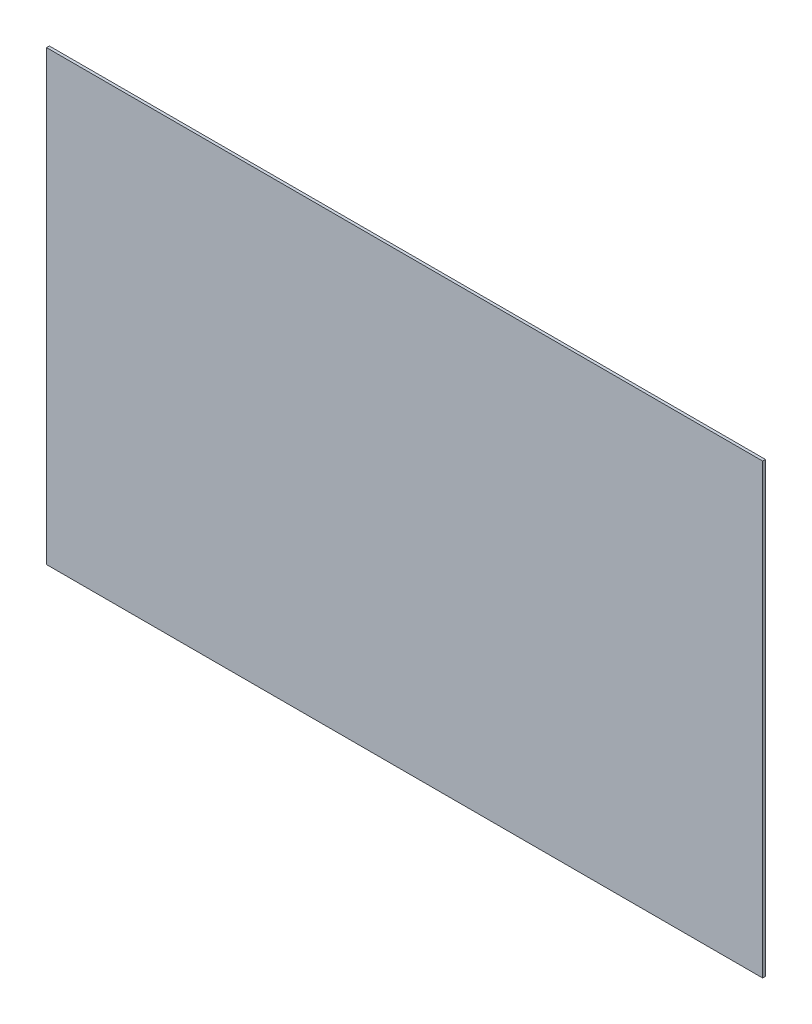
ISO-10303-21;
HEADER;
FILE_DESCRIPTION(('STEP AP214'),'2;1');
FILE_NAME('part.step','',(''),(''),'','','');
FILE_SCHEMA(('AUTOMOTIVE_DESIGN { 1 0 10303 214 1 1 1 1 }'));
ENDSEC;
DATA;
#1=APPLICATION_CONTEXT('core data for automotive mechanical design processes');
#2=APPLICATION_PROTOCOL_DEFINITION('international standard','automotive_design',2000,#1);
#3=PRODUCT_CONTEXT('',#1,'mechanical');
#4=PRODUCT('Part','Part','',(#3));
#5=PRODUCT_RELATED_PRODUCT_CATEGORY('part','',(#4));
#6=PRODUCT_DEFINITION_FORMATION('','',#4);
#7=PRODUCT_DEFINITION_CONTEXT('part definition',#1,'design');
#8=PRODUCT_DEFINITION('design','',#6,#7);
#9=PRODUCT_DEFINITION_SHAPE('','',#8);
#10=(LENGTH_UNIT() NAMED_UNIT(*) SI_UNIT(.MILLI.,.METRE.));
#11=(NAMED_UNIT(*) PLANE_ANGLE_UNIT() SI_UNIT($,.RADIAN.));
#12=(NAMED_UNIT(*) SI_UNIT($,.STERADIAN.) SOLID_ANGLE_UNIT());
#13=UNCERTAINTY_MEASURE_WITH_UNIT(LENGTH_MEASURE(1.E-05),#10,'distance_accuracy_value','');
#14=(GEOMETRIC_REPRESENTATION_CONTEXT(3) GLOBAL_UNCERTAINTY_ASSIGNED_CONTEXT((#13)) GLOBAL_UNIT_ASSIGNED_CONTEXT((#10,
#11,#12)) REPRESENTATION_CONTEXT('',''));
#15=CARTESIAN_POINT('',(0.,0.,0.));
#16=DIRECTION('',(0.,0.,1.));
#17=DIRECTION('',(1.,0.,0.));
#18=AXIS2_PLACEMENT_3D('',#15,#16,#17);
#19=CARTESIAN_POINT('',(406.4,-254.127,3.175));
#20=DIRECTION('',(-1.,0.,0.));
#21=DIRECTION('',(0.,0.,1.));
#22=AXIS2_PLACEMENT_3D('',#19,#20,#21);
#23=PLANE('',#22);
#24=DIRECTION('',(0.,1.,0.));
#25=VECTOR('',#24,1.);
#26=CARTESIAN_POINT('',(406.4,-254.127,0.));
#27=LINE('',#26,#25);
#28=CARTESIAN_POINT('',(406.4,-254.127,0.));
#29=VERTEX_POINT('',#28);
#30=CARTESIAN_POINT('',(406.4,254.127,0.));
#31=VERTEX_POINT('',#30);
#32=EDGE_CURVE('E118',#29,#31,#27,.T.);
#33=ORIENTED_EDGE('',*,*,#32,.T.);
#34=DIRECTION('',(0.,0.,-1.));
#35=VECTOR('',#34,1.);
#36=CARTESIAN_POINT('',(406.4,254.127,3.175));
#37=LINE('',#36,#35);
#38=CARTESIAN_POINT('',(406.4,254.127,3.175));
#39=VERTEX_POINT('',#38);
#40=EDGE_CURVE('E12',#39,#31,#37,.T.);
#41=ORIENTED_EDGE('',*,*,#40,.F.);
#42=DIRECTION('',(0.,1.,0.));
#43=VECTOR('',#42,1.);
#44=CARTESIAN_POINT('',(406.4,-254.127,3.175));
#45=LINE('',#44,#43);
#46=CARTESIAN_POINT('',(406.4,-254.127,3.175));
#47=VERTEX_POINT('',#46);
#48=EDGE_CURVE('E87',#47,#39,#45,.T.);
#49=ORIENTED_EDGE('',*,*,#48,.F.);
#50=DIRECTION('',(0.,0.,-1.));
#51=VECTOR('',#50,1.);
#52=CARTESIAN_POINT('',(406.4,-254.127,3.175));
#53=LINE('',#52,#51);
#54=EDGE_CURVE('E98',#47,#29,#53,.T.);
#55=ORIENTED_EDGE('',*,*,#54,.T.);
#56=EDGE_LOOP('',(#33,#41,#49,#55));
#57=FACE_BOUND('',#56,.T.);
#58=ADVANCED_FACE('F36',(#57),#23,.F.);
#59=CARTESIAN_POINT('',(-406.4,254.127,3.175));
#60=DIRECTION('',(0.,-1.,0.));
#61=DIRECTION('',(0.,0.,-1.));
#62=AXIS2_PLACEMENT_3D('',#59,#60,#61);
#63=PLANE('',#62);
#64=DIRECTION('',(-1.,0.,0.));
#65=VECTOR('',#64,1.);
#66=CARTESIAN_POINT('',(-406.4,254.127,0.));
#67=LINE('',#66,#65);
#68=CARTESIAN_POINT('',(-406.4,254.127,0.));
#69=VERTEX_POINT('',#68);
#70=EDGE_CURVE('E92',#31,#69,#67,.T.);
#71=ORIENTED_EDGE('',*,*,#70,.T.);
#72=DIRECTION('',(0.,0.,-1.));
#73=VECTOR('',#72,1.);
#74=CARTESIAN_POINT('',(-406.4,254.127,3.175));
#75=LINE('',#74,#73);
#76=CARTESIAN_POINT('',(-406.4,254.127,3.175));
#77=VERTEX_POINT('',#76);
#78=EDGE_CURVE('E44',#77,#69,#75,.T.);
#79=ORIENTED_EDGE('',*,*,#78,.F.);
#80=DIRECTION('',(-1.,0.,0.));
#81=VECTOR('',#80,1.);
#82=CARTESIAN_POINT('',(-406.4,254.127,3.175));
#83=LINE('',#82,#81);
#84=EDGE_CURVE('E82',#39,#77,#83,.T.);
#85=ORIENTED_EDGE('',*,*,#84,.F.);
#86=ORIENTED_EDGE('',*,*,#40,.T.);
#87=EDGE_LOOP('',(#71,#79,#85,#86));
#88=FACE_BOUND('',#87,.T.);
#89=ADVANCED_FACE('F91',(#88),#63,.F.);
#90=CARTESIAN_POINT('',(-406.4,-254.127,3.175));
#91=DIRECTION('',(1.,0.,0.));
#92=DIRECTION('',(0.,0.,-1.));
#93=AXIS2_PLACEMENT_3D('',#90,#91,#92);
#94=PLANE('',#93);
#95=DIRECTION('',(0.,-1.,0.));
#96=VECTOR('',#95,1.);
#97=CARTESIAN_POINT('',(-406.4,-254.127,0.));
#98=LINE('',#97,#96);
#99=CARTESIAN_POINT('',(-406.4,-254.127,0.));
#100=VERTEX_POINT('',#99);
#101=EDGE_CURVE('E69',#69,#100,#98,.T.);
#102=ORIENTED_EDGE('',*,*,#101,.T.);
#103=DIRECTION('',(0.,0.,-1.));
#104=VECTOR('',#103,1.);
#105=CARTESIAN_POINT('',(-406.4,-254.127,3.175));
#106=LINE('',#105,#104);
#107=CARTESIAN_POINT('',(-406.4,-254.127,3.175));
#108=VERTEX_POINT('',#107);
#109=EDGE_CURVE('E93',#108,#100,#106,.T.);
#110=ORIENTED_EDGE('',*,*,#109,.F.);
#111=DIRECTION('',(0.,-1.,0.));
#112=VECTOR('',#111,1.);
#113=CARTESIAN_POINT('',(-406.4,-254.127,3.175));
#114=LINE('',#113,#112);
#115=EDGE_CURVE('E85',#77,#108,#114,.T.);
#116=ORIENTED_EDGE('',*,*,#115,.F.);
#117=ORIENTED_EDGE('',*,*,#78,.T.);
#118=EDGE_LOOP('',(#102,#110,#116,#117));
#119=FACE_BOUND('',#118,.T.);
#120=ADVANCED_FACE('F94',(#119),#94,.F.);
#121=CARTESIAN_POINT('',(-406.4,-254.127,3.175));
#122=DIRECTION('',(0.,1.,0.));
#123=DIRECTION('',(0.,0.,1.));
#124=AXIS2_PLACEMENT_3D('',#121,#122,#123);
#125=PLANE('',#124);
#126=DIRECTION('',(1.,0.,0.));
#127=VECTOR('',#126,1.);
#128=CARTESIAN_POINT('',(-406.4,-254.127,0.));
#129=LINE('',#128,#127);
#130=EDGE_CURVE('E75',#100,#29,#129,.T.);
#131=ORIENTED_EDGE('',*,*,#130,.T.);
#132=ORIENTED_EDGE('',*,*,#54,.F.);
#133=DIRECTION('',(1.,0.,0.));
#134=VECTOR('',#133,1.);
#135=CARTESIAN_POINT('',(-406.4,-254.127,3.175));
#136=LINE('',#135,#134);
#137=EDGE_CURVE('E52',#108,#47,#136,.T.);
#138=ORIENTED_EDGE('',*,*,#137,.F.);
#139=ORIENTED_EDGE('',*,*,#109,.T.);
#140=EDGE_LOOP('',(#131,#132,#138,#139));
#141=FACE_BOUND('',#140,.T.);
#142=ADVANCED_FACE('F113',(#141),#125,.F.);
#143=CARTESIAN_POINT('',(0.,0.,3.175));
#144=DIRECTION('',(0.,0.,-1.));
#145=DIRECTION('',(-1.,0.,0.));
#146=AXIS2_PLACEMENT_3D('',#143,#144,#145);
#147=PLANE('',#146);
#148=ORIENTED_EDGE('',*,*,#48,.T.);
#149=ORIENTED_EDGE('',*,*,#84,.T.);
#150=ORIENTED_EDGE('',*,*,#115,.T.);
#151=ORIENTED_EDGE('',*,*,#137,.T.);
#152=EDGE_LOOP('',(#148,#149,#150,#151));
#153=FACE_BOUND('',#152,.T.);
#154=ADVANCED_FACE('F83',(#153),#147,.F.);
#155=CARTESIAN_POINT('',(0.,0.,0.));
#156=DIRECTION('',(0.,0.,-1.));
#157=DIRECTION('',(-1.,0.,0.));
#158=AXIS2_PLACEMENT_3D('',#155,#156,#157);
#159=PLANE('',#158);
#160=ORIENTED_EDGE('',*,*,#32,.F.);
#161=ORIENTED_EDGE('',*,*,#130,.F.);
#162=ORIENTED_EDGE('',*,*,#101,.F.);
#163=ORIENTED_EDGE('',*,*,#70,.F.);
#164=EDGE_LOOP('',(#160,#161,#162,#163));
#165=FACE_BOUND('',#164,.T.);
#166=ADVANCED_FACE('F116',(#165),#159,.T.);
#167=CLOSED_SHELL('',(#58,#89,#120,#142,#154,#166));
#168=MANIFOLD_SOLID_BREP('B2',#167);
#169=ADVANCED_BREP_SHAPE_REPRESENTATION('',(#18,#168),#14);
#170=SHAPE_DEFINITION_REPRESENTATION(#9,#169);
ENDSEC;
END-ISO-10303-21;
